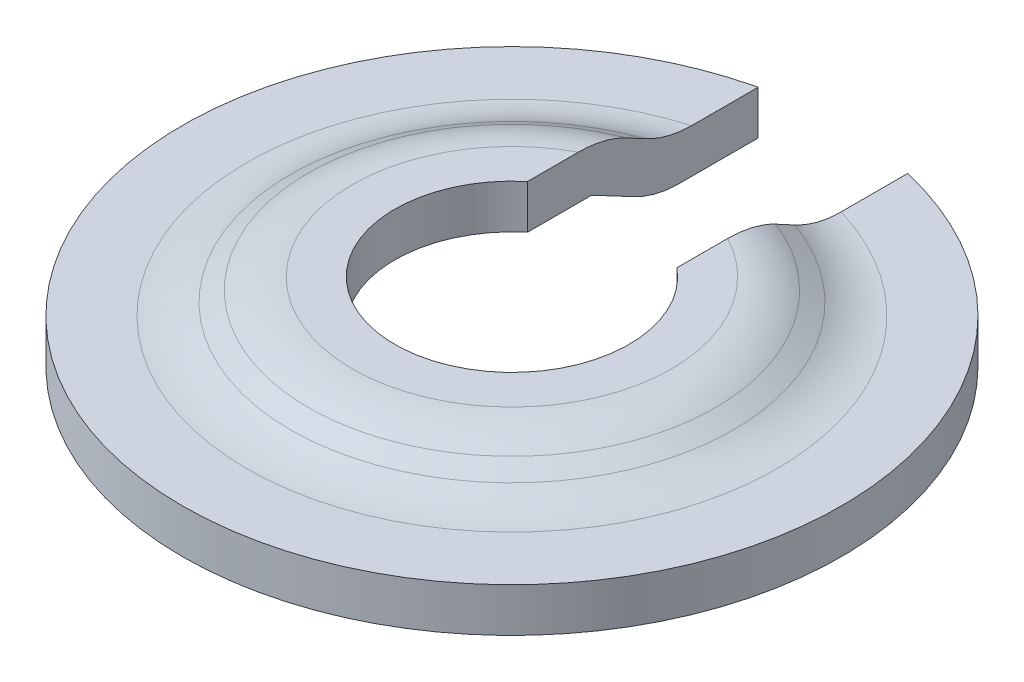
ISO-10303-21;
HEADER;
FILE_DESCRIPTION(('STEP AP214'),'2;1');
FILE_NAME('part.step','',(''),(''),'','','');
FILE_SCHEMA(('AUTOMOTIVE_DESIGN { 1 0 10303 214 1 1 1 1 }'));
ENDSEC;
DATA;
#1=APPLICATION_CONTEXT('core data for automotive mechanical design processes');
#2=APPLICATION_PROTOCOL_DEFINITION('international standard','automotive_design',2000,#1);
#3=PRODUCT_CONTEXT('',#1,'mechanical');
#4=PRODUCT('Part','Part','',(#3));
#5=PRODUCT_RELATED_PRODUCT_CATEGORY('part','',(#4));
#6=PRODUCT_DEFINITION_FORMATION('','',#4);
#7=PRODUCT_DEFINITION_CONTEXT('part definition',#1,'design');
#8=PRODUCT_DEFINITION('design','',#6,#7);
#9=PRODUCT_DEFINITION_SHAPE('','',#8);
#10=(LENGTH_UNIT() NAMED_UNIT(*) SI_UNIT(.MILLI.,.METRE.));
#11=(NAMED_UNIT(*) PLANE_ANGLE_UNIT() SI_UNIT($,.RADIAN.));
#12=(NAMED_UNIT(*) SI_UNIT($,.STERADIAN.) SOLID_ANGLE_UNIT());
#13=UNCERTAINTY_MEASURE_WITH_UNIT(LENGTH_MEASURE(1.E-05),#10,'distance_accuracy_value','');
#14=(GEOMETRIC_REPRESENTATION_CONTEXT(3) GLOBAL_UNCERTAINTY_ASSIGNED_CONTEXT((#13)) GLOBAL_UNIT_ASSIGNED_CONTEXT((#10,
#11,#12)) REPRESENTATION_CONTEXT('',''));
#15=CARTESIAN_POINT('',(0.,0.,0.));
#16=DIRECTION('',(0.,0.,1.));
#17=DIRECTION('',(1.,0.,0.));
#18=AXIS2_PLACEMENT_3D('',#15,#16,#17);
#19=CARTESIAN_POINT('',(11.6989885243169,2.29999999999998,0.));
#20=DIRECTION('',(0.,-1.,0.));
#21=DIRECTION('',(0.,0.,-1.));
#22=AXIS2_PLACEMENT_3D('',#19,#20,#21);
#23=PLANE('',#22);
#24=CARTESIAN_POINT('',(0.,2.29999999999998,0.));
#25=DIRECTION('',(0.,-1.,0.));
#26=DIRECTION('',(0.,0.,-1.));
#27=AXIS2_PLACEMENT_3D('',#24,#25,#26);
#28=CIRCLE('',#27,11.6989885243169);
#29=CARTESIAN_POINT('',(5.1,2.29999999999998,-10.5288333870424));
#30=VERTEX_POINT('',#29);
#31=CARTESIAN_POINT('',(-5.1,2.29999999999998,-10.5288333870424));
#32=VERTEX_POINT('',#31);
#33=EDGE_CURVE('E220',#30,#32,#28,.T.);
#34=ORIENTED_EDGE('',*,*,#33,.T.);
#35=DIRECTION('',(0.,0.,1.));
#36=VECTOR('',#35,1.);
#37=CARTESIAN_POINT('',(-5.1,2.29999999999998,0.));
#38=LINE('',#37,#36);
#39=CARTESIAN_POINT('',(-5.1,2.29999999999998,-6.16360284249399));
#40=VERTEX_POINT('',#39);
#41=EDGE_CURVE('E245',#32,#40,#38,.T.);
#42=ORIENTED_EDGE('',*,*,#41,.T.);
#43=CARTESIAN_POINT('',(0.,2.29999999999998,0.));
#44=DIRECTION('',(0.,-1.,0.));
#45=DIRECTION('',(0.,0.,-1.));
#46=AXIS2_PLACEMENT_3D('',#43,#44,#45);
#47=CIRCLE('',#46,8.);
#48=CARTESIAN_POINT('',(5.1,2.29999999999998,-6.16360284249399));
#49=VERTEX_POINT('',#48);
#50=EDGE_CURVE('E148',#49,#40,#47,.T.);
#51=ORIENTED_EDGE('',*,*,#50,.F.);
#52=DIRECTION('',(0.,0.,-1.));
#53=VECTOR('',#52,1.);
#54=CARTESIAN_POINT('',(5.1,2.29999999999998,0.));
#55=LINE('',#54,#53);
#56=EDGE_CURVE('E236',#49,#30,#55,.T.);
#57=ORIENTED_EDGE('',*,*,#56,.T.);
#58=EDGE_LOOP('',(#34,#42,#51,#57));
#59=FACE_BOUND('',#58,.T.);
#60=ADVANCED_FACE('F37',(#59),#23,.T.);
#61=CARTESIAN_POINT('',(0.,0.,0.));
#62=DIRECTION('',(0.,-1.,0.));
#63=DIRECTION('',(0.,0.,-1.));
#64=AXIS2_PLACEMENT_3D('',#61,#62,#63);
#65=CYLINDRICAL_SURFACE('',#64,8.);
#66=ORIENTED_EDGE('',*,*,#50,.T.);
#67=DIRECTION('',(0.,-1.,0.));
#68=VECTOR('',#67,1.);
#69=CARTESIAN_POINT('',(-5.1,5.29999999999998,-6.16360284249399));
#70=LINE('',#69,#68);
#71=CARTESIAN_POINT('',(-5.1,5.29999999999998,-6.16360284249399));
#72=VERTEX_POINT('',#71);
#73=EDGE_CURVE('E131',#72,#40,#70,.T.);
#74=ORIENTED_EDGE('',*,*,#73,.F.);
#75=CARTESIAN_POINT('',(0.,5.29999999999998,0.));
#76=DIRECTION('',(0.,-1.,0.));
#77=DIRECTION('',(0.,0.,-1.));
#78=AXIS2_PLACEMENT_3D('',#75,#76,#77);
#79=CIRCLE('',#78,8.);
#80=CARTESIAN_POINT('',(5.1,5.29999999999998,-6.16360284249399));
#81=VERTEX_POINT('',#80);
#82=EDGE_CURVE('E146',#81,#72,#79,.T.);
#83=ORIENTED_EDGE('',*,*,#82,.F.);
#84=DIRECTION('',(0.,-1.,0.));
#85=VECTOR('',#84,1.);
#86=CARTESIAN_POINT('',(5.1,5.29999999999998,-6.16360284249399));
#87=LINE('',#86,#85);
#88=EDGE_CURVE('E150',#81,#49,#87,.T.);
#89=ORIENTED_EDGE('',*,*,#88,.T.);
#90=EDGE_LOOP('',(#66,#74,#83,#89));
#91=FACE_BOUND('',#90,.T.);
#92=ADVANCED_FACE('F144',(#91),#65,.F.);
#93=CARTESIAN_POINT('',(8.,5.29999999999998,0.));
#94=DIRECTION('',(0.,1.,0.));
#95=DIRECTION('',(0.,0.,1.));
#96=AXIS2_PLACEMENT_3D('',#93,#94,#95);
#97=PLANE('',#96);
#98=DIRECTION('',(0.,0.,1.));
#99=VECTOR('',#98,1.);
#100=CARTESIAN_POINT('',(-5.1,5.29999999999998,-21.9143788412996));
#101=LINE('',#100,#99);
#102=CARTESIAN_POINT('',(-5.1,5.29999999999998,-9.63098664481205));
#103=VERTEX_POINT('',#102);
#104=EDGE_CURVE('E126',#103,#72,#101,.T.);
#105=ORIENTED_EDGE('',*,*,#104,.F.);
#106=CARTESIAN_POINT('',(0.,5.29999999999998,0.));
#107=DIRECTION('',(0.,1.,0.));
#108=DIRECTION('',(0.,0.,1.));
#109=AXIS2_PLACEMENT_3D('',#106,#107,#108);
#110=CIRCLE('',#109,10.8979770486338);
#111=CARTESIAN_POINT('',(5.1,5.29999999999998,-9.63098664481205));
#112=VERTEX_POINT('',#111);
#113=EDGE_CURVE('E251',#103,#112,#110,.T.);
#114=ORIENTED_EDGE('',*,*,#113,.T.);
#115=DIRECTION('',(0.,0.,-1.));
#116=VECTOR('',#115,1.);
#117=CARTESIAN_POINT('',(5.1,5.29999999999998,-21.9143788412996));
#118=LINE('',#117,#116);
#119=EDGE_CURVE('E138',#81,#112,#118,.T.);
#120=ORIENTED_EDGE('',*,*,#119,.F.);
#121=ORIENTED_EDGE('',*,*,#82,.T.);
#122=EDGE_LOOP('',(#105,#114,#120,#121));
#123=FACE_BOUND('',#122,.T.);
#124=ADVANCED_FACE('F153',(#123),#97,.T.);
#125=CARTESIAN_POINT('',(0.,3.,0.));
#126=DIRECTION('',(0.,-1.,0.));
#127=DIRECTION('',(0.,0.,-1.));
#128=AXIS2_PLACEMENT_3D('',#125,#126,#127);
#129=CONICAL_SURFACE('',#128,16.5,1.04896204698049);
#130=CARTESIAN_POINT('',(-5.1,9.55296317849649,0.1901157284375));
#131=CARTESIAN_POINT('',(-5.1,9.55607957172124,0.0463834502401844));
#132=CARTESIAN_POINT('',(-5.1,9.55563674338152,-0.0974176373172059));
#133=CARTESIAN_POINT('',(-5.1,9.54781303183114,-0.384786128201741));
#134=CARTESIAN_POINT('',(-5.1,9.54043437534839,-0.528353591715286));
#135=CARTESIAN_POINT('',(-5.1,9.51896333886721,-0.814414326924621));
#136=CARTESIAN_POINT('',(-5.1,9.50489739476457,-0.956909603301413));
#137=CARTESIAN_POINT('',(-5.1,9.47046803482646,-1.24114072941346));
#138=CARTESIAN_POINT('',(-5.1,9.45010419353683,-1.38287652718388));
#139=CARTESIAN_POINT('',(-5.1,9.40386400792132,-1.66373355434222));
#140=CARTESIAN_POINT('',(-5.1,9.37805502951542,-1.80286596232513));
#141=CARTESIAN_POINT('',(-5.1,9.321345172236,-2.08008220059289));
#142=CARTESIAN_POINT('',(-5.1,9.29044429755677,-2.21816603174138));
#143=CARTESIAN_POINT('',(-5.1,9.22409059610711,-2.49336409545285));
#144=CARTESIAN_POINT('',(-5.1,9.18863361702643,-2.63047732165053));
#145=CARTESIAN_POINT('',(-5.1,9.11373996845758,-2.90359811904372));
#146=CARTESIAN_POINT('',(-5.1,9.0743034993878,-3.03960574554796));
#147=CARTESIAN_POINT('',(-5.1,8.95151971296859,-3.44366307437824));
#148=CARTESIAN_POINT('',(-5.1,8.8630938854299,-3.71017270727363));
#149=CARTESIAN_POINT('',(-5.1,8.67596263624379,-4.23958072878997));
#150=CARTESIAN_POINT('',(-5.1,8.57725437083111,-4.5024780955073));
#151=CARTESIAN_POINT('',(-5.1,8.37197814382059,-5.02546806144299));
#152=CARTESIAN_POINT('',(-5.1,8.26540251158604,-5.28555763222692));
#153=CARTESIAN_POINT('',(-5.1,8.04634240526522,-5.80319088619396));
#154=CARTESIAN_POINT('',(-5.1,7.9338585165347,-6.06073481859142));
#155=CARTESIAN_POINT('',(-5.1,7.70403536799718,-6.57441890706242));
#156=CARTESIAN_POINT('',(-5.1,7.58668458426274,-6.83055388840514));
#157=CARTESIAN_POINT('',(-5.1,7.34839308616679,-7.34115203564278));
#158=CARTESIAN_POINT('',(-5.1,7.22745227441369,-7.5956151559537));
#159=CARTESIAN_POINT('',(-5.1,6.98271713127133,-8.1031900438728));
#160=CARTESIAN_POINT('',(-5.1,6.85892255129427,-8.35630169137277));
#161=CARTESIAN_POINT('',(-5.1,6.60904891808886,-8.86139532870104));
#162=CARTESIAN_POINT('',(-5.1,6.48296984825907,-9.11337731030342));
#163=CARTESIAN_POINT('',(-5.1,6.22640476208608,-9.62145266634858));
#164=CARTESIAN_POINT('',(-5.1,6.09588108944855,-9.87752700318566));
#165=CARTESIAN_POINT('',(-5.1,5.83325773367336,-10.3888479791515));
#166=CARTESIAN_POINT('',(-5.1,5.70115813587965,-10.6440946621582));
#167=CARTESIAN_POINT('',(-5.1,5.43562902215168,-11.1539409865656));
#168=CARTESIAN_POINT('',(-5.1,5.30219931981347,-11.4085405308175));
#169=CARTESIAN_POINT('',(-5.1,5.03423915603399,-11.9171640567502));
#170=CARTESIAN_POINT('',(-5.1,4.89970867844993,-12.1711880299202));
#171=CARTESIAN_POINT('',(-5.1,4.49518507275341,-12.931675542099));
#172=CARTESIAN_POINT('',(-5.1,4.22381459463736,-13.4374064511795));
#173=CARTESIAN_POINT('',(-5.1,3.67840499889728,-14.4474014708612));
#174=CARTESIAN_POINT('',(-5.1,3.40436597513877,-14.9516656322505));
#175=CARTESIAN_POINT('',(-5.1,2.78812119246208,-16.0802431504483));
#176=CARTESIAN_POINT('',(-5.1,2.44537264682694,-16.7042599809845));
#177=CARTESIAN_POINT('',(-5.1,1.75748009201861,-17.9513288233478));
#178=CARTESIAN_POINT('',(-5.1,1.41233509472445,-18.5743802895027));
#179=CARTESIAN_POINT('',(-5.1,0.727159956783541,-19.8073286197947));
#180=CARTESIAN_POINT('',(-5.1,0.387162417569195,-20.4172436120324));
#181=CARTESIAN_POINT('',(-5.1,-0.293944526438689,-21.6360974760313));
#182=CARTESIAN_POINT('',(-5.1,-0.635053370896874,-22.2450366608434));
#183=CARTESIAN_POINT('',(-5.1,-0.976618922685051,-22.8537185709315));
#184=B_SPLINE_CURVE_WITH_KNOTS('',3,(#130,#131,#132,#133,#134,#135,#136,#137,#138,#139,#140,
#141,#142,#143,#144,#145,#146,#147,#148,#149,#150,#151,#152,#153,#154,#155,#156,#157,#158,#159,
#160,#161,#162,#163,#164,#165,#166,#167,#168,#169,#170,#171,#172,#173,#174,#175,#176,#177,#178,
#179,#180,#181,#182,#183),.UNSPECIFIED.,.F.,.F.,(4,2,2,2,2,2,2,2,2,2,2,2,2,2,2,2,2,2,2,2,2,2,2,
2,2,2,4),(0.,0.431242451383631,0.862346500874103,1.29176032223896,1.72120315897464,
2.14561563295658,2.57002775734251,2.99482945987672,3.41960977886094,4.26168145305432,
5.10398663646777,5.94712419437326,6.7901783760907,7.63535758710814,8.4805597474499,
9.32583581249246,10.171118022648,11.0333726028351,11.8955806978655,12.7579113727096,
13.6202547163153,15.3420581907716,17.063801318377,19.1996460508378,21.3364310376289,
23.4312686643049,25.5251767146299),.UNSPECIFIED.);
#185=CARTESIAN_POINT('',(-5.1,4.5014378183452,-12.9185475512261));
#186=VERTEX_POINT('',#185);
#187=CARTESIAN_POINT('',(-5.1,3.79856218165477,-14.2245650468027));
#188=VERTEX_POINT('',#187);
#189=EDGE_CURVE('E213',#186,#188,#184,.T.);
#190=ORIENTED_EDGE('',*,*,#189,.T.);
#191=CARTESIAN_POINT('',(0.,3.79856218165477,0.));
#192=DIRECTION('',(0.,-1.,0.));
#193=DIRECTION('',(0.,0.,-1.));
#194=AXIS2_PLACEMENT_3D('',#191,#192,#193);
#195=CIRCLE('',#194,15.1111962058178);
#196=CARTESIAN_POINT('',(5.1,3.79856218165089,-14.2245650468099));
#197=VERTEX_POINT('',#196);
#198=EDGE_CURVE('E65',#188,#197,#195,.F.);
#199=ORIENTED_EDGE('',*,*,#198,.T.);
#200=CARTESIAN_POINT('',(5.1,-0.976618922685051,-22.8537185709315));
#201=CARTESIAN_POINT('',(5.1,-0.651232813004716,-22.2738754759289));
#202=CARTESIAN_POINT('',(5.1,-0.326264800800887,-21.6937969841501));
#203=CARTESIAN_POINT('',(5.1,0.322544560096384,-20.5330005124774));
#204=CARTESIAN_POINT('',(5.1,0.64638589411883,-19.952282524385));
#205=CARTESIAN_POINT('',(5.1,1.29290331200183,-18.7895852067539));
#206=CARTESIAN_POINT('',(5.1,1.61557824682372,-18.2076052379319));
#207=CARTESIAN_POINT('',(5.1,2.25905237024648,-17.0426151277479));
#208=CARTESIAN_POINT('',(5.1,2.5798515753133,-16.4596049954877));
#209=CARTESIAN_POINT('',(5.1,3.23860696836771,-15.256283935386));
#210=CARTESIAN_POINT('',(5.1,3.57640389540487,-14.635885753853));
#211=CARTESIAN_POINT('',(5.1,4.24803322145338,-13.3929183456899));
#212=CARTESIAN_POINT('',(5.1,4.58186550860723,-12.7703490584427));
#213=CARTESIAN_POINT('',(5.1,5.07810849544521,-11.8343053690274));
#214=CARTESIAN_POINT('',(5.1,5.2427313715649,-11.5220041030423));
#215=CARTESIAN_POINT('',(5.1,5.57013848770332,-10.8964399052205));
#216=CARTESIAN_POINT('',(5.1,5.7329227360286,-10.5831769777366));
#217=CARTESIAN_POINT('',(5.1,6.05618054778265,-9.95547833702534));
#218=CARTESIAN_POINT('',(5.1,6.21665421887485,-9.64104267930757));
#219=CARTESIAN_POINT('',(5.1,6.53466309744162,-9.0106908394516));
#220=CARTESIAN_POINT('',(5.1,6.69219834636902,-8.69477467827791));
#221=CARTESIAN_POINT('',(5.1,6.96680763956395,-8.13565952250549));
#222=CARTESIAN_POINT('',(5.1,7.08467577793308,-7.89285095654116));
#223=CARTESIAN_POINT('',(5.1,7.31764167889283,-7.40590208791816));
#224=CARTESIAN_POINT('',(5.1,7.43273940999714,-7.16176177016246));
#225=CARTESIAN_POINT('',(5.1,7.65955054671613,-6.67167711113673));
#226=CARTESIAN_POINT('',(5.1,7.77126122574576,-6.42573150456671));
#227=CARTESIAN_POINT('',(5.1,7.99026255087331,-5.93187871812626));
#228=CARTESIAN_POINT('',(5.1,8.09755329004292,-5.68397157969144));
#229=CARTESIAN_POINT('',(5.1,8.30457744316205,-5.19023479025327));
#230=CARTESIAN_POINT('',(5.1,8.40441194629817,-4.94444773301561));
#231=CARTESIAN_POINT('',(5.1,8.59699845069621,-4.45006156857144));
#232=CARTESIAN_POINT('',(5.1,8.6897496406675,-4.20146214298168));
#233=CARTESIAN_POINT('',(5.1,8.86589472566181,-3.70127611177865));
#234=CARTESIAN_POINT('',(5.1,8.94929970542302,-3.44969344466351));
#235=CARTESIAN_POINT('',(5.1,9.10405271032056,-2.94287792695045));
#236=CARTESIAN_POINT('',(5.1,9.17540484079851,-2.68764635147182));
#237=CARTESIAN_POINT('',(5.1,9.29167054516936,-2.21762383221478));
#238=CARTESIAN_POINT('',(5.1,9.33902116646851,-2.00344044786872));
#239=CARTESIAN_POINT('',(5.1,9.42096255942005,-1.57266268811611));
#240=CARTESIAN_POINT('',(5.1,9.45555789555176,-1.35606920380313));
#241=CARTESIAN_POINT('',(5.1,9.49659635575074,-1.02854659533529));
#242=CARTESIAN_POINT('',(5.1,9.50850360695506,-0.918285912393345));
#243=CARTESIAN_POINT('',(5.1,9.52837302314945,-0.697406656201031));
#244=CARTESIAN_POINT('',(5.1,9.53633527416404,-0.586788090807587));
#245=CARTESIAN_POINT('',(5.1,9.54817783447499,-0.365154807780288));
#246=CARTESIAN_POINT('',(5.1,9.55205159528764,-0.254139739517304));
#247=CARTESIAN_POINT('',(5.1,9.55564059396634,-0.0320302012772721));
#248=CARTESIAN_POINT('',(5.1,9.55535536278976,0.0790642762426));
#249=CARTESIAN_POINT('',(5.1,9.55296317849649,0.1901157284375));
#250=B_SPLINE_CURVE_WITH_KNOTS('',3,(#200,#201,#202,#203,#204,#205,#206,#207,#208,#209,#210,
#211,#212,#213,#214,#215,#216,#217,#218,#219,#220,#221,#222,#223,#224,#225,#226,#227,#228,#229,
#230,#231,#232,#233,#234,#235,#236,#237,#238,#239,#240,#241,#242,#243,#244,#245,#246,#247,#248,
#249),.UNSPECIFIED.,.F.,.F.,(4,2,2,2,2,2,2,2,2,2,2,2,2,2,2,2,2,2,2,2,2,2,2,2,4),(0.,
1.99470564287393,3.98943716323747,5.98577580828097,7.98209690223219,10.1012876924011,
12.2205381315903,13.2796345557035,14.338726193128,15.3977683204724,16.4567954964089,
17.2664979087106,18.0762095191233,18.8865565177186,19.6968864439194,20.4926699543953,
21.2885444740418,22.0834648550802,22.8781139285678,23.5358726273361,24.1933957181471,
24.5260415495715,24.8586801270141,25.191850682707,25.5250588129871),.UNSPECIFIED.);
#251=CARTESIAN_POINT('',(5.1,4.5014378183452,-12.9185475512261));
#252=VERTEX_POINT('',#251);
#253=EDGE_CURVE('E205',#197,#252,#250,.T.);
#254=ORIENTED_EDGE('',*,*,#253,.T.);
#255=CARTESIAN_POINT('',(0.,4.5014378183452,0.));
#256=DIRECTION('',(0.,1.,0.));
#257=DIRECTION('',(0.,0.,1.));
#258=AXIS2_PLACEMENT_3D('',#255,#256,#257);
#259=CIRCLE('',#258,13.8888037941822);
#260=EDGE_CURVE('E252',#252,#186,#259,.F.);
#261=ORIENTED_EDGE('',*,*,#260,.T.);
#262=EDGE_LOOP('',(#190,#199,#254,#261));
#263=FACE_BOUND('',#262,.T.);
#264=ADVANCED_FACE('F197',(#263),#129,.T.);
#265=CARTESIAN_POINT('',(16.5,2.99999999999999,0.));
#266=DIRECTION('',(0.,1.,0.));
#267=DIRECTION('',(0.,0.,1.));
#268=AXIS2_PLACEMENT_3D('',#265,#266,#267);
#269=PLANE('',#268);
#270=DIRECTION('',(0.,0.,1.));
#271=VECTOR('',#270,1.);
#272=CARTESIAN_POINT('',(5.1,2.99999999999999,0.));
#273=LINE('',#272,#271);
#274=CARTESIAN_POINT('',(5.1,2.99999999999998,-21.9143788412996));
#275=VERTEX_POINT('',#274);
#276=CARTESIAN_POINT('',(5.1,2.99999999999999,-17.3687430440948));
#277=VERTEX_POINT('',#276);
#278=EDGE_CURVE('E239',#275,#277,#273,.T.);
#279=ORIENTED_EDGE('',*,*,#278,.T.);
#280=CARTESIAN_POINT('',(0.,2.99999999999999,0.));
#281=DIRECTION('',(0.,1.,0.));
#282=DIRECTION('',(0.,0.,1.));
#283=AXIS2_PLACEMENT_3D('',#280,#281,#282);
#284=CIRCLE('',#283,18.1020229513663);
#285=CARTESIAN_POINT('',(-5.1,2.99999999999999,-17.3687430440948));
#286=VERTEX_POINT('',#285);
#287=EDGE_CURVE('E249',#277,#286,#284,.F.);
#288=ORIENTED_EDGE('',*,*,#287,.T.);
#289=DIRECTION('',(0.,0.,-1.));
#290=VECTOR('',#289,1.);
#291=CARTESIAN_POINT('',(-5.1,2.99999999999999,0.));
#292=LINE('',#291,#290);
#293=CARTESIAN_POINT('',(-5.1,2.99999999999998,-21.9143788412996));
#294=VERTEX_POINT('',#293);
#295=EDGE_CURVE('E221',#286,#294,#292,.T.);
#296=ORIENTED_EDGE('',*,*,#295,.T.);
#297=CARTESIAN_POINT('',(0.,2.99999999999998,0.));
#298=DIRECTION('',(0.,-1.,0.));
#299=DIRECTION('',(0.,0.,-1.));
#300=AXIS2_PLACEMENT_3D('',#297,#298,#299);
#301=CIRCLE('',#300,22.5);
#302=EDGE_CURVE('E154',#275,#294,#301,.T.);
#303=ORIENTED_EDGE('',*,*,#302,.F.);
#304=EDGE_LOOP('',(#279,#288,#296,#303));
#305=FACE_BOUND('',#304,.T.);
#306=ADVANCED_FACE('F193',(#305),#269,.T.);
#307=CARTESIAN_POINT('',(0.,0.,0.));
#308=DIRECTION('',(0.,-1.,0.));
#309=DIRECTION('',(0.,0.,-1.));
#310=AXIS2_PLACEMENT_3D('',#307,#308,#309);
#311=CYLINDRICAL_SURFACE('',#310,22.5);
#312=ORIENTED_EDGE('',*,*,#302,.T.);
#313=DIRECTION('',(0.,-1.,0.));
#314=VECTOR('',#313,1.);
#315=CARTESIAN_POINT('',(-5.1,5.29999999999998,-21.9143788412996));
#316=LINE('',#315,#314);
#317=CARTESIAN_POINT('',(-5.1,0.,-21.9143788412996));
#318=VERTEX_POINT('',#317);
#319=EDGE_CURVE('E149',#294,#318,#316,.T.);
#320=ORIENTED_EDGE('',*,*,#319,.T.);
#321=CARTESIAN_POINT('',(0.,0.,0.));
#322=DIRECTION('',(0.,-1.,0.));
#323=DIRECTION('',(0.,0.,-1.));
#324=AXIS2_PLACEMENT_3D('',#321,#322,#323);
#325=CIRCLE('',#324,22.5);
#326=CARTESIAN_POINT('',(5.1,0.,-21.9143788412996));
#327=VERTEX_POINT('',#326);
#328=EDGE_CURVE('E159',#327,#318,#325,.T.);
#329=ORIENTED_EDGE('',*,*,#328,.F.);
#330=DIRECTION('',(0.,-1.,0.));
#331=VECTOR('',#330,1.);
#332=CARTESIAN_POINT('',(5.1,5.29999999999998,-21.9143788412996));
#333=LINE('',#332,#331);
#334=EDGE_CURVE('E232',#275,#327,#333,.T.);
#335=ORIENTED_EDGE('',*,*,#334,.F.);
#336=EDGE_LOOP('',(#312,#320,#329,#335));
#337=FACE_BOUND('',#336,.T.);
#338=ADVANCED_FACE('F189',(#337),#311,.T.);
#339=CARTESIAN_POINT('',(22.5,0.,0.));
#340=DIRECTION('',(0.,-1.,0.));
#341=DIRECTION('',(0.,0.,-1.));
#342=AXIS2_PLACEMENT_3D('',#339,#340,#341);
#343=PLANE('',#342);
#344=DIRECTION('',(0.,0.,1.));
#345=VECTOR('',#344,1.);
#346=CARTESIAN_POINT('',(-5.1,0.,-21.9143788412996));
#347=LINE('',#346,#345);
#348=CARTESIAN_POINT('',(-5.1,0.,-16.5322411693551));
#349=VERTEX_POINT('',#348);
#350=EDGE_CURVE('E226',#318,#349,#347,.T.);
#351=ORIENTED_EDGE('',*,*,#350,.T.);
#352=CARTESIAN_POINT('',(0.,0.,0.));
#353=DIRECTION('',(0.,-1.,0.));
#354=DIRECTION('',(0.,0.,-1.));
#355=AXIS2_PLACEMENT_3D('',#352,#353,#354);
#356=CIRCLE('',#355,17.3010114756831);
#357=CARTESIAN_POINT('',(5.1,0.,-16.5322411693551));
#358=VERTEX_POINT('',#357);
#359=EDGE_CURVE('E292',#349,#358,#356,.F.);
#360=ORIENTED_EDGE('',*,*,#359,.T.);
#361=DIRECTION('',(0.,0.,-1.));
#362=VECTOR('',#361,1.);
#363=CARTESIAN_POINT('',(5.1,0.,-21.9143788412996));
#364=LINE('',#363,#362);
#365=EDGE_CURVE('E139',#358,#327,#364,.T.);
#366=ORIENTED_EDGE('',*,*,#365,.T.);
#367=ORIENTED_EDGE('',*,*,#328,.T.);
#368=EDGE_LOOP('',(#351,#360,#366,#367));
#369=FACE_BOUND('',#368,.T.);
#370=ADVANCED_FACE('F183',(#369),#343,.T.);
#371=CARTESIAN_POINT('',(0.,2.29999999999998,0.));
#372=DIRECTION('',(0.,-1.,0.));
#373=DIRECTION('',(0.,0.,-1.));
#374=AXIS2_PLACEMENT_3D('',#371,#372,#373);
#375=CONICAL_SURFACE('',#374,11.6989885243169,1.04896204698049);
#376=CARTESIAN_POINT('',(5.1,-7.41582673243188,-28.1376208166485));
#377=CARTESIAN_POINT('',(5.1,-7.08767032119982,-27.5576032105788));
#378=CARTESIAN_POINT('',(5.1,-6.7597484343579,-26.9774527475162));
#379=CARTESIAN_POINT('',(5.1,-6.10449626512873,-25.8168168273082));
#380=CARTESIAN_POINT('',(5.1,-5.77716598353333,-25.2363313697156));
#381=CARTESIAN_POINT('',(5.1,-5.1232060076189,-24.0749320667131));
#382=CARTESIAN_POINT('',(5.1,-4.79657634490335,-23.4940182035034));
#383=CARTESIAN_POINT('',(5.1,-4.14420375477042,-22.3316930966714));
#384=CARTESIAN_POINT('',(5.1,-3.81846082685228,-21.7502818533302));
#385=CARTESIAN_POINT('',(5.1,-3.16514159373155,-20.5815654486918));
#386=CARTESIAN_POINT('',(5.1,-2.83757542268768,-19.9942546201317));
#387=CARTESIAN_POINT('',(5.1,-2.18389784876543,-18.8188240724566));
#388=CARTESIAN_POINT('',(5.1,-1.85778644500061,-18.2307043538348));
#389=CARTESIAN_POINT('',(5.1,-1.20747314723394,-17.0534195433106));
#390=CARTESIAN_POINT('',(5.1,-0.883271227467826,-16.4642544656533));
#391=CARTESIAN_POINT('',(5.1,-0.23743645642469,-15.2845198299612));
#392=CARTESIAN_POINT('',(5.1,0.0841964034214893,-14.6939502766197));
#393=CARTESIAN_POINT('',(5.1,0.75257129100639,-13.4579130645013));
#394=CARTESIAN_POINT('',(5.1,1.09898221396746,-12.8122657905037));
#395=CARTESIAN_POINT('',(5.1,1.61386705527147,-11.8412799332345));
#396=CARTESIAN_POINT('',(5.1,1.78470777534379,-11.5171968337639));
#397=CARTESIAN_POINT('',(5.1,2.12440209984973,-10.8679910086582));
#398=CARTESIAN_POINT('',(5.1,2.29325571095343,-10.5428682865174));
#399=CARTESIAN_POINT('',(5.1,2.62775520650445,-9.89268328778846));
#400=CARTESIAN_POINT('',(5.1,2.79341150778304,-9.56762637856966));
#401=CARTESIAN_POINT('',(5.1,3.12151388883913,-8.91589779305212));
#402=CARTESIAN_POINT('',(5.1,3.28396000312818,-8.58922613416022));
#403=CARTESIAN_POINT('',(5.1,3.60467020628416,-7.93375901635638));
#404=CARTESIAN_POINT('',(5.1,3.76293356807983,-7.60496320041178));
#405=CARTESIAN_POINT('',(5.1,4.0737967797235,-6.94471461696));
#406=CARTESIAN_POINT('',(5.1,4.2263968591903,-6.61326195783905));
#407=CARTESIAN_POINT('',(5.1,4.53150568390496,-5.92974111196464));
#408=CARTESIAN_POINT('',(5.1,4.68360674386321,-5.57748882457341));
#409=CARTESIAN_POINT('',(5.1,4.9024768066777,-5.04542363800203));
#410=CARTESIAN_POINT('',(5.1,4.97386513379922,-4.86751184795906));
#411=CARTESIAN_POINT('',(5.1,5.11290723906052,-4.51023853742254));
#412=CARTESIAN_POINT('',(5.1,5.18056119517045,-4.33087708648382));
#413=CARTESIAN_POINT('',(5.1,5.31163581735124,-3.96974514545503));
#414=CARTESIAN_POINT('',(5.1,5.37503732597026,-3.78796766699729));
#415=CARTESIAN_POINT('',(5.1,5.49630799276764,-3.42260195819901));
#416=CARTESIAN_POINT('',(5.1,5.55417809193749,-3.23901404172946));
#417=CARTESIAN_POINT('',(5.1,5.66337011196823,-2.86942429200613));
#418=CARTESIAN_POINT('',(5.1,5.71467687171787,-2.68341792550844));
#419=CARTESIAN_POINT('',(5.1,5.80925405243711,-2.30926352716874));
#420=CARTESIAN_POINT('',(5.1,5.85251960355793,-2.12111427028588));
#421=CARTESIAN_POINT('',(5.1,5.89106531493873,-1.93193700295647));
#422=B_SPLINE_CURVE_WITH_KNOTS('',3,(#376,#377,#378,#379,#380,#381,#382,#383,#384,#385,#386,
#387,#388,#389,#390,#391,#392,#393,#394,#395,#396,#397,#398,#399,#400,#401,#402,#403,#404,#405,
#406,#407,#408,#409,#410,#411,#412,#413,#414,#415,#416,#417,#418,#419,#420,#421),.UNSPECIFIED.,
.F.,.F.,(4,2,2,2,2,2,2,2,2,2,2,2,2,2,2,2,2,2,2,2,2,2,4),(0.,1.99924089307345,3.99848446008706,
5.99781638827583,7.99714718717081,10.0145950696457,12.0320417226433,14.0494610920035,
16.0668737294057,18.2649699853774,19.3640315541415,20.463089432662,21.557578398689,
22.6520555918575,23.7467217987769,24.8413435736611,25.9922169329367,26.5672843410261,
27.1423243192329,27.7198015154587,28.2971802970037,28.8758696052637,29.454908240541),.UNSPECIFIED.);
#423=CARTESIAN_POINT('',(5.1,0.798562181655912,-13.3705417620425));
#424=VERTEX_POINT('',#423);
#425=EDGE_CURVE('E156',#30,#424,#422,.F.);
#426=ORIENTED_EDGE('',*,*,#425,.T.);
#427=CARTESIAN_POINT('',(0.,0.79856218165477,0.));
#428=DIRECTION('',(0.,1.,0.));
#429=DIRECTION('',(0.,0.,1.));
#430=AXIS2_PLACEMENT_3D('',#427,#428,#429);
#431=CIRCLE('',#430,14.3101847301346);
#432=CARTESIAN_POINT('',(-5.1,0.798562181655912,-13.3705417620425));
#433=VERTEX_POINT('',#432);
#434=EDGE_CURVE('E293',#424,#433,#431,.F.);
#435=ORIENTED_EDGE('',*,*,#434,.T.);
#436=CARTESIAN_POINT('',(-5.1,-7.41582673243188,-28.1376208166485));
#437=CARTESIAN_POINT('',(-5.1,-7.08767032119982,-27.5576032105788));
#438=CARTESIAN_POINT('',(-5.1,-6.7597484343579,-26.9774527475162));
#439=CARTESIAN_POINT('',(-5.1,-6.10449626512873,-25.8168168273082));
#440=CARTESIAN_POINT('',(-5.1,-5.77716598353333,-25.2363313697156));
#441=CARTESIAN_POINT('',(-5.1,-5.1232060076189,-24.0749320667131));
#442=CARTESIAN_POINT('',(-5.1,-4.79657634490335,-23.4940182035034));
#443=CARTESIAN_POINT('',(-5.1,-4.14420375477042,-22.3316930966714));
#444=CARTESIAN_POINT('',(-5.1,-3.81846082685228,-21.7502818533302));
#445=CARTESIAN_POINT('',(-5.1,-3.16514159373155,-20.5815654486918));
#446=CARTESIAN_POINT('',(-5.1,-2.83757542268768,-19.9942546201317));
#447=CARTESIAN_POINT('',(-5.1,-2.18389784876543,-18.8188240724566));
#448=CARTESIAN_POINT('',(-5.1,-1.85778644500061,-18.2307043538348));
#449=CARTESIAN_POINT('',(-5.1,-1.20747314723394,-17.0534195433106));
#450=CARTESIAN_POINT('',(-5.1,-0.883271227467826,-16.4642544656533));
#451=CARTESIAN_POINT('',(-5.1,-0.23743645642469,-15.2845198299612));
#452=CARTESIAN_POINT('',(-5.1,0.0841964034214893,-14.6939502766197));
#453=CARTESIAN_POINT('',(-5.1,0.75257129100639,-13.4579130645013));
#454=CARTESIAN_POINT('',(-5.1,1.09898221396746,-12.8122657905037));
#455=CARTESIAN_POINT('',(-5.1,1.61386705527147,-11.8412799332345));
#456=CARTESIAN_POINT('',(-5.1,1.78470777534379,-11.5171968337639));
#457=CARTESIAN_POINT('',(-5.1,2.12440209984973,-10.8679910086582));
#458=CARTESIAN_POINT('',(-5.1,2.29325571095343,-10.5428682865174));
#459=CARTESIAN_POINT('',(-5.1,2.62775520650445,-9.89268328778846));
#460=CARTESIAN_POINT('',(-5.1,2.79341150778304,-9.56762637856966));
#461=CARTESIAN_POINT('',(-5.1,3.12151388883913,-8.91589779305212));
#462=CARTESIAN_POINT('',(-5.1,3.28396000312818,-8.58922613416022));
#463=CARTESIAN_POINT('',(-5.1,3.60467020628416,-7.93375901635638));
#464=CARTESIAN_POINT('',(-5.1,3.76293356807983,-7.60496320041178));
#465=CARTESIAN_POINT('',(-5.1,4.0737967797235,-6.94471461696));
#466=CARTESIAN_POINT('',(-5.1,4.2263968591903,-6.61326195783905));
#467=CARTESIAN_POINT('',(-5.1,4.53150568390496,-5.92974111196464));
#468=CARTESIAN_POINT('',(-5.1,4.68360674386321,-5.57748882457341));
#469=CARTESIAN_POINT('',(-5.1,4.9024768066777,-5.04542363800203));
#470=CARTESIAN_POINT('',(-5.1,4.97386513379922,-4.86751184795906));
#471=CARTESIAN_POINT('',(-5.1,5.11290723906052,-4.51023853742254));
#472=CARTESIAN_POINT('',(-5.1,5.18056119517045,-4.33087708648382));
#473=CARTESIAN_POINT('',(-5.1,5.31163581735124,-3.96974514545503));
#474=CARTESIAN_POINT('',(-5.1,5.37503732597026,-3.78796766699729));
#475=CARTESIAN_POINT('',(-5.1,5.49630799276764,-3.42260195819901));
#476=CARTESIAN_POINT('',(-5.1,5.55417809193749,-3.23901404172946));
#477=CARTESIAN_POINT('',(-5.1,5.66337011196823,-2.86942429200613));
#478=CARTESIAN_POINT('',(-5.1,5.71467687171787,-2.68341792550844));
#479=CARTESIAN_POINT('',(-5.1,5.80925405243711,-2.30926352716874));
#480=CARTESIAN_POINT('',(-5.1,5.85251960355793,-2.12111427028588));
#481=CARTESIAN_POINT('',(-5.1,5.89106531493873,-1.93193700295647));
#482=B_SPLINE_CURVE_WITH_KNOTS('',3,(#436,#437,#438,#439,#440,#441,#442,#443,#444,#445,#446,
#447,#448,#449,#450,#451,#452,#453,#454,#455,#456,#457,#458,#459,#460,#461,#462,#463,#464,#465,
#466,#467,#468,#469,#470,#471,#472,#473,#474,#475,#476,#477,#478,#479,#480,#481),.UNSPECIFIED.,
.F.,.F.,(4,2,2,2,2,2,2,2,2,2,2,2,2,2,2,2,2,2,2,2,2,2,4),(0.,1.99924089307345,3.99848446008706,
5.99781638827583,7.99714718717081,10.0145950696457,12.0320417226433,14.0494610920035,
16.0668737294057,18.2649699853774,19.3640315541415,20.463089432662,21.557578398689,
22.6520555918575,23.7467217987769,24.8413435736611,25.9922169329367,26.5672843410261,
27.1423243192329,27.7198015154587,28.2971802970037,28.8758696052637,29.454908240541),.UNSPECIFIED.);
#483=EDGE_CURVE('E170',#433,#32,#482,.T.);
#484=ORIENTED_EDGE('',*,*,#483,.T.);
#485=ORIENTED_EDGE('',*,*,#33,.F.);
#486=EDGE_LOOP('',(#426,#435,#484,#485));
#487=FACE_BOUND('',#486,.T.);
#488=ADVANCED_FACE('F179',(#487),#375,.F.);
#489=CARTESIAN_POINT('',(5.1,5.29999999999998,-21.9143788412996));
#490=DIRECTION('',(-1.,0.,0.));
#491=DIRECTION('',(0.,0.,1.));
#492=AXIS2_PLACEMENT_3D('',#489,#490,#491);
#493=PLANE('',#492);
#494=ORIENTED_EDGE('',*,*,#365,.F.);
#495=CARTESIAN_POINT('',(5.1,0.,-16.5322411693551));
#496=CARTESIAN_POINT('',(5.1,-1.71979276737196E-05,-16.3424769185931));
#497=CARTESIAN_POINT('',(5.1,0.00821942882811855,-16.1527253470937));
#498=CARTESIAN_POINT('',(5.1,0.0409299284254826,-15.7745758371639));
#499=CARTESIAN_POINT('',(5.1,0.0654079485823934,-15.5861782569056));
#500=CARTESIAN_POINT('',(5.1,0.129676103189735,-15.2159336505445));
#501=CARTESIAN_POINT('',(5.1,0.169147577941805,-15.0340311360875));
#502=CARTESIAN_POINT('',(5.1,0.263043934640919,-14.6742106121601));
#503=CARTESIAN_POINT('',(5.1,0.317462181611806,-14.49629087252));
#504=CARTESIAN_POINT('',(5.1,0.436395204768999,-14.1582216149715));
#505=CARTESIAN_POINT('',(5.1,0.499899467597099,-13.9977156167657));
#506=CARTESIAN_POINT('',(5.1,0.639714718092713,-13.6805499368029));
#507=CARTESIAN_POINT('',(5.1,0.716142134448229,-13.5239415759748));
#508=CARTESIAN_POINT('',(5.1,0.798562181654038,-13.370541762046));
#509=B_SPLINE_CURVE_WITH_KNOTS('',3,(#495,#496,#497,#498,#499,#500,#501,#502,#503,#504,#505,
#506,#507,#508),.UNSPECIFIED.,.F.,.F.,(4,2,2,2,2,2,4),(0.,0.56909717800718,1.13833973358195,
1.69610569635769,2.2536244619902,2.77095652630741,3.29322537330212),.UNSPECIFIED.);
#510=EDGE_CURVE('E282',#358,#424,#509,.T.);
#511=ORIENTED_EDGE('',*,*,#510,.T.);
#512=ORIENTED_EDGE('',*,*,#425,.F.);
#513=ORIENTED_EDGE('',*,*,#56,.F.);
#514=ORIENTED_EDGE('',*,*,#88,.F.);
#515=ORIENTED_EDGE('',*,*,#119,.T.);
#516=CARTESIAN_POINT('',(5.1,5.29999999999998,-9.63098664481205));
#517=CARTESIAN_POINT('',(5.1,5.2999999680092,-9.74875461533719));
#518=CARTESIAN_POINT('',(5.1,5.29729112496616,-9.86650776397532));
#519=CARTESIAN_POINT('',(5.1,5.28633669360119,-10.1017732641957));
#520=CARTESIAN_POINT('',(5.1,5.27809025915935,-10.2192855762265));
#521=CARTESIAN_POINT('',(5.1,5.24483443693482,-10.5714356666529));
#522=CARTESIAN_POINT('',(5.1,5.21130780650717,-10.8053384374392));
#523=CARTESIAN_POINT('',(5.1,5.12209855419283,-11.2627744942017));
#524=CARTESIAN_POINT('',(5.1,5.06699130237902,-11.4864207992474));
#525=CARTESIAN_POINT('',(5.1,4.93445540412212,-11.9267691105603));
#526=CARTESIAN_POINT('',(5.1,4.85705658060265,-12.1434799678719));
#527=CARTESIAN_POINT('',(5.1,4.72869143468801,-12.4511161861021));
#528=CARTESIAN_POINT('',(5.1,4.68653544051721,-12.5457930050947));
#529=CARTESIAN_POINT('',(5.1,4.59749790505135,-12.7335625642942));
#530=CARTESIAN_POINT('',(5.1,4.55059066483569,-12.8266431156669));
#531=CARTESIAN_POINT('',(5.1,4.50143781834365,-12.9185475512291));
#532=B_SPLINE_CURVE_WITH_KNOTS('',3,(#516,#517,#518,#519,#520,#521,#522,#523,#524,#525,#526,
#527,#528,#529,#530,#531),.UNSPECIFIED.,.F.,.F.,(4,2,2,2,2,2,2,4),(0.,0.353239737608927,
0.706533460998962,1.41416114847298,2.10408281896294,2.79308572709528,3.10390031934128,
3.41649629234672),.UNSPECIFIED.);
#533=EDGE_CURVE('E58',#112,#252,#532,.T.);
#534=ORIENTED_EDGE('',*,*,#533,.T.);
#535=ORIENTED_EDGE('',*,*,#253,.F.);
#536=CARTESIAN_POINT('',(5.09999999999772,3.79856218165477,-14.2245650468035));
#537=CARTESIAN_POINT('',(5.09999999999918,3.70924212046803,-14.3895623777829));
#538=CARTESIAN_POINT('',(5.09999999999978,3.62696612886249,-14.5583687247758));
#539=CARTESIAN_POINT('',(5.10000000000022,3.47696582958849,-14.902407839125));
#540=CARTESIAN_POINT('',(5.10000000000006,3.40924729899292,-15.0776431256058));
#541=CARTESIAN_POINT('',(5.09999999999994,3.29012538775261,-15.4295865847175));
#542=CARTESIAN_POINT('',(5.09999999999998,3.23841717919399,-15.6061916696111));
#543=CARTESIAN_POINT('',(5.10000000000001,3.1498813779157,-15.9630076058293));
#544=CARTESIAN_POINT('',(5.1,3.11304662471359,-16.143216678135));
#545=CARTESIAN_POINT('',(5.09999999999999,3.05611812185316,-16.4963362016549));
#546=CARTESIAN_POINT('',(5.1,3.03523196458591,-16.6691192650452));
#547=CARTESIAN_POINT('',(5.1,3.00709874621673,-17.0175035905625));
#548=CARTESIAN_POINT('',(5.1,2.99998796084098,-17.1931158520872));
#549=CARTESIAN_POINT('',(5.1,2.99999999999999,-17.3687430440948));
#550=B_SPLINE_CURVE_WITH_KNOTS('',3,(#536,#537,#538,#539,#540,#541,#542,#543,#544,#545,#546,
#547,#548,#549),.UNSPECIFIED.,.F.,.F.,(4,2,2,2,2,2,4),(0.,0.562694454525344,1.12561180164661,
1.67703813288743,2.22819867519852,2.7497775988977,3.27649051877578),.UNSPECIFIED.);
#551=EDGE_CURVE('E11',#197,#277,#550,.T.);
#552=ORIENTED_EDGE('',*,*,#551,.T.);
#553=ORIENTED_EDGE('',*,*,#278,.F.);
#554=ORIENTED_EDGE('',*,*,#334,.T.);
#555=EDGE_LOOP('',(#494,#511,#512,#513,#514,#515,#534,#535,#552,#553,#554));
#556=FACE_BOUND('',#555,.T.);
#557=ADVANCED_FACE('F177',(#556),#493,.T.);
#558=CARTESIAN_POINT('',(-5.1,5.29999999999998,-21.9143788412996));
#559=DIRECTION('',(1.,0.,0.));
#560=DIRECTION('',(0.,0.,-1.));
#561=AXIS2_PLACEMENT_3D('',#558,#559,#560);
#562=PLANE('',#561);
#563=ORIENTED_EDGE('',*,*,#483,.F.);
#564=CARTESIAN_POINT('',(-5.09999999999576,0.79856218165477,-13.3705417620462));
#565=CARTESIAN_POINT('',(-5.09999999999847,0.708746667296285,-13.5376976539039));
#566=CARTESIAN_POINT('',(-5.09999999999959,0.626047982619077,-13.7086745784932));
#567=CARTESIAN_POINT('',(-5.10000000000041,0.475356390819104,-14.0570776344999));
#568=CARTESIAN_POINT('',(-5.10000000000011,0.407369756600695,-14.2345064793654));
#569=CARTESIAN_POINT('',(-5.09999999999989,0.287877204310356,-14.590821719131));
#570=CARTESIAN_POINT('',(-5.09999999999997,0.236064691970968,-14.7696053760684));
#571=CARTESIAN_POINT('',(-5.10000000000003,0.147502264304733,-15.1307772776081));
#572=CARTESIAN_POINT('',(-5.10000000000001,0.11074488447849,-15.3131636887898));
#573=CARTESIAN_POINT('',(-5.09999999999999,0.0546990060709074,-15.6671089702858));
#574=CARTESIAN_POINT('',(-5.1,0.0343411337253349,-15.8384991809694));
#575=CARTESIAN_POINT('',(-5.1,0.00692141628062768,-16.1839941842612));
#576=CARTESIAN_POINT('',(-5.10000000000001,-1.09720921878432E-05,-16.3581092441116));
#577=CARTESIAN_POINT('',(-5.1,0.,-16.5322411693551));
#578=B_SPLINE_CURVE_WITH_KNOTS('',3,(#564,#565,#566,#567,#568,#569,#570,#571,#572,#573,#574,
#575,#576,#577),.UNSPECIFIED.,.F.,.F.,(4,2,2,2,2,2,4),(0.,0.569100292134558,1.1384427604531,
1.69622540465568,2.25373115836312,2.77099733326083,3.29322694609017),.UNSPECIFIED.);
#579=EDGE_CURVE('E274',#433,#349,#578,.T.);
#580=ORIENTED_EDGE('',*,*,#579,.T.);
#581=ORIENTED_EDGE('',*,*,#350,.F.);
#582=ORIENTED_EDGE('',*,*,#319,.F.);
#583=ORIENTED_EDGE('',*,*,#295,.F.);
#584=CARTESIAN_POINT('',(-5.1,2.99999999999999,-17.3687430440948));
#585=CARTESIAN_POINT('',(-5.1,2.99998289676884,-17.1811160052559));
#586=CARTESIAN_POINT('',(-5.1,3.00810154167754,-16.9934996391113));
#587=CARTESIAN_POINT('',(-5.1,3.04036389077585,-16.6195967921383));
#588=CARTESIAN_POINT('',(-5.1,3.06451192591803,-16.4333106844831));
#589=CARTESIAN_POINT('',(-5.1,3.12793572239675,-16.0672351933023));
#590=CARTESIAN_POINT('',(-5.1,3.16689429904037,-15.8873907022479));
#591=CARTESIAN_POINT('',(-5.1,3.25960033814271,-15.5316373635759));
#592=CARTESIAN_POINT('',(-5.1,3.31334124596406,-15.3557268089051));
#593=CARTESIAN_POINT('',(-5.1,3.4319554082992,-15.0182688020986));
#594=CARTESIAN_POINT('',(-5.1,3.49607766832931,-14.8564568464434));
#595=CARTESIAN_POINT('',(-5.1,3.63751467325962,-14.5368053427786));
#596=CARTESIAN_POINT('',(-5.1,3.71495259385316,-14.3790202933036));
#597=CARTESIAN_POINT('',(-5.1,3.79856218165477,-14.2245650468027));
#598=B_SPLINE_CURVE_WITH_KNOTS('',3,(#584,#585,#586,#587,#588,#589,#590,#591,#592,#593,#594,
#595,#596,#597),.UNSPECIFIED.,.F.,.F.,(4,2,2,2,2,2,4),(0.,0.562691513476246,1.12553512149226,
1.67694808849151,2.22811694636902,2.74974624576436,3.27648959451686),.UNSPECIFIED.);
#599=EDGE_CURVE('E51',#286,#188,#598,.T.);
#600=ORIENTED_EDGE('',*,*,#599,.T.);
#601=ORIENTED_EDGE('',*,*,#189,.F.);
#602=CARTESIAN_POINT('',(-5.1,4.5014378183452,-12.9185475512261));
#603=CARTESIAN_POINT('',(-5.1,4.59466786580198,-12.7442961449882));
#604=CARTESIAN_POINT('',(-5.1,4.67978657653152,-12.5657595836797));
#605=CARTESIAN_POINT('',(-5.1,4.83363131873891,-12.2018071018694));
#606=CARTESIAN_POINT('',(-5.1,4.90236178058434,-12.0163930563118));
#607=CARTESIAN_POINT('',(-5.1,5.02211816352047,-11.6439886950542));
#608=CARTESIAN_POINT('',(-5.1,5.0734664717035,-11.457101555857));
#609=CARTESIAN_POINT('',(-5.1,5.16038824814541,-11.0797585312774));
#610=CARTESIAN_POINT('',(-5.1,5.19596632844724,-10.8893037062787));
#611=CARTESIAN_POINT('',(-5.1,5.24931863643936,-10.5220016734015));
#612=CARTESIAN_POINT('',(-5.1,5.26832094597578,-10.3453302398425));
#613=CARTESIAN_POINT('',(-5.1,5.29372886942034,-9.98943194267983));
#614=CARTESIAN_POINT('',(-5.1,5.30001606619823,-9.81019657284227));
#615=CARTESIAN_POINT('',(-5.1,5.29999999999998,-9.63098664481205));
#616=B_SPLINE_CURVE_WITH_KNOTS('',3,(#602,#603,#604,#605,#606,#607,#608,#609,#610,#611,#612,
#613,#614,#615),.UNSPECIFIED.,.F.,.F.,(4,2,2,2,2,2,4),(0.,0.592594098166532,1.18502781349543,
1.76577947321865,2.34636117841304,2.87897591394527,3.41652851613297),.UNSPECIFIED.);
#617=EDGE_CURVE('E134',#186,#103,#616,.T.);
#618=ORIENTED_EDGE('',*,*,#617,.T.);
#619=ORIENTED_EDGE('',*,*,#104,.T.);
#620=ORIENTED_EDGE('',*,*,#73,.T.);
#621=ORIENTED_EDGE('',*,*,#41,.F.);
#622=EDGE_LOOP('',(#563,#580,#581,#582,#583,#600,#601,#618,#619,#620,#621));
#623=FACE_BOUND('',#622,.T.);
#624=ADVANCED_FACE('F129',(#623),#562,.T.);
#625=CARTESIAN_POINT('',(0.,5.99999999999998,0.));
#626=DIRECTION('',(0.,-1.,0.));
#627=DIRECTION('',(0.,0.,-1.));
#628=AXIS2_PLACEMENT_3D('',#625,#626,#627);
#629=TOROIDAL_SURFACE('',#628,17.3010114756831,6.);
#630=ORIENTED_EDGE('',*,*,#510,.F.);
#631=ORIENTED_EDGE('',*,*,#359,.F.);
#632=ORIENTED_EDGE('',*,*,#579,.F.);
#633=ORIENTED_EDGE('',*,*,#434,.F.);
#634=EDGE_LOOP('',(#630,#631,#632,#633));
#635=FACE_BOUND('',#634,.T.);
#636=ADVANCED_FACE('F266',(#635),#629,.T.);
#637=CARTESIAN_POINT('',(0.,8.99999999999999,0.));
#638=DIRECTION('',(0.,1.,0.));
#639=DIRECTION('',(0.,0.,1.));
#640=AXIS2_PLACEMENT_3D('',#637,#638,#639);
#641=TOROIDAL_SURFACE('',#640,18.1020229513663,6.);
#642=ORIENTED_EDGE('',*,*,#551,.F.);
#643=ORIENTED_EDGE('',*,*,#198,.F.);
#644=ORIENTED_EDGE('',*,*,#599,.F.);
#645=ORIENTED_EDGE('',*,*,#287,.F.);
#646=EDGE_LOOP('',(#642,#643,#644,#645));
#647=FACE_BOUND('',#646,.T.);
#648=ADVANCED_FACE('F254',(#647),#641,.F.);
#649=CARTESIAN_POINT('',(0.,-0.700000000000017,0.));
#650=DIRECTION('',(0.,1.,0.));
#651=DIRECTION('',(0.,0.,1.));
#652=AXIS2_PLACEMENT_3D('',#649,#650,#651);
#653=TOROIDAL_SURFACE('',#652,10.8979770486338,6.);
#654=ORIENTED_EDGE('',*,*,#533,.F.);
#655=ORIENTED_EDGE('',*,*,#113,.F.);
#656=ORIENTED_EDGE('',*,*,#617,.F.);
#657=ORIENTED_EDGE('',*,*,#260,.F.);
#658=EDGE_LOOP('',(#654,#655,#656,#657));
#659=FACE_BOUND('',#658,.T.);
#660=ADVANCED_FACE('F39',(#659),#653,.T.);
#661=CLOSED_SHELL('',(#60,#92,#124,#264,#306,#338,#370,#488,#557,#624,#636,#648,#660));
#662=MANIFOLD_SOLID_BREP('B2',#661);
#663=ADVANCED_BREP_SHAPE_REPRESENTATION('',(#18,#662),#14);
#664=SHAPE_DEFINITION_REPRESENTATION(#9,#663);
ENDSEC;
END-ISO-10303-21;
